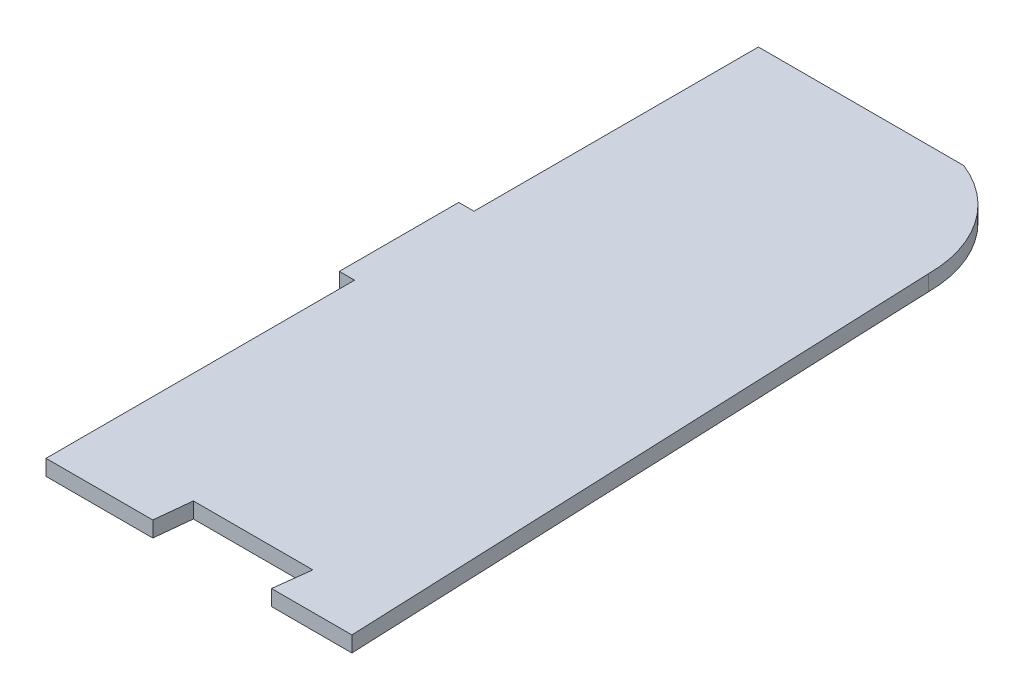
ISO-10303-21;
HEADER;
FILE_DESCRIPTION(('STEP AP214'),'2;1');
FILE_NAME('part.step','',(''),(''),'','','');
FILE_SCHEMA(('AUTOMOTIVE_DESIGN { 1 0 10303 214 1 1 1 1 }'));
ENDSEC;
DATA;
#1=APPLICATION_CONTEXT('core data for automotive mechanical design processes');
#2=APPLICATION_PROTOCOL_DEFINITION('international standard','automotive_design',2000,#1);
#3=PRODUCT_CONTEXT('',#1,'mechanical');
#4=PRODUCT('Part','Part','',(#3));
#5=PRODUCT_RELATED_PRODUCT_CATEGORY('part','',(#4));
#6=PRODUCT_DEFINITION_FORMATION('','',#4);
#7=PRODUCT_DEFINITION_CONTEXT('part definition',#1,'design');
#8=PRODUCT_DEFINITION('design','',#6,#7);
#9=PRODUCT_DEFINITION_SHAPE('','',#8);
#10=(LENGTH_UNIT() NAMED_UNIT(*) SI_UNIT(.MILLI.,.METRE.));
#11=(NAMED_UNIT(*) PLANE_ANGLE_UNIT() SI_UNIT($,.RADIAN.));
#12=(NAMED_UNIT(*) SI_UNIT($,.STERADIAN.) SOLID_ANGLE_UNIT());
#13=UNCERTAINTY_MEASURE_WITH_UNIT(LENGTH_MEASURE(1.E-05),#10,'distance_accuracy_value','');
#14=(GEOMETRIC_REPRESENTATION_CONTEXT(3) GLOBAL_UNCERTAINTY_ASSIGNED_CONTEXT((#13)) GLOBAL_UNIT_ASSIGNED_CONTEXT((#10,
#11,#12)) REPRESENTATION_CONTEXT('',''));
#15=CARTESIAN_POINT('',(0.,0.,0.));
#16=DIRECTION('',(0.,0.,1.));
#17=DIRECTION('',(1.,0.,0.));
#18=AXIS2_PLACEMENT_3D('',#15,#16,#17);
#19=CARTESIAN_POINT('',(358.121789204402,754.380000017288,879.470073525841));
#20=DIRECTION('',(0.,-1.,0.));
#21=DIRECTION('',(0.,0.,-1.));
#22=AXIS2_PLACEMENT_3D('',#19,#20,#21);
#23=PLANE('',#22);
#24=CARTESIAN_POINT('',(368.663785013315,754.380000017288,70.9700591000901));
#25=DIRECTION('',(0.,1.,0.));
#26=DIRECTION('',(0.,0.,1.));
#27=AXIS2_PLACEMENT_3D('',#24,#25,#26);
#28=CIRCLE('',#27,76.2);
#29=CARTESIAN_POINT('',(444.863785013315,754.380000017288,70.9700591000901));
#30=VERTEX_POINT('',#29);
#31=CARTESIAN_POINT('',(396.407085309598,754.380000017288,0.));
#32=VERTEX_POINT('',#31);
#33=EDGE_CURVE('E281',#30,#32,#28,.T.);
#34=ORIENTED_EDGE('',*,*,#33,.T.);
#35=DIRECTION('',(-1.,0.,0.));
#36=VECTOR('',#35,1.);
#37=CARTESIAN_POINT('',(358.121789204402,754.380000017288,0.));
#38=LINE('',#37,#36);
#39=CARTESIAN_POINT('',(265.355188860333,754.380000017288,0.));
#40=VERTEX_POINT('',#39);
#41=EDGE_CURVE('E218',#32,#40,#38,.T.);
#42=ORIENTED_EDGE('',*,*,#41,.T.);
#43=DIRECTION('',(0.,0.,-1.));
#44=VECTOR('',#43,1.);
#45=CARTESIAN_POINT('',(265.355188860333,754.380000017288,0.));
#46=LINE('',#45,#44);
#47=CARTESIAN_POINT('',(265.355188860333,754.380000017288,181.46005910007));
#48=VERTEX_POINT('',#47);
#49=EDGE_CURVE('E213',#48,#40,#46,.T.);
#50=ORIENTED_EDGE('',*,*,#49,.F.);
#51=DIRECTION('',(-1.,0.,0.));
#52=VECTOR('',#51,1.);
#53=CARTESIAN_POINT('',(0.,754.380000017288,181.46005910007));
#54=LINE('',#53,#52);
#55=CARTESIAN_POINT('',(255.630013474232,754.380000017288,181.46005910007));
#56=VERTEX_POINT('',#55);
#57=EDGE_CURVE('E196',#48,#56,#54,.T.);
#58=ORIENTED_EDGE('',*,*,#57,.T.);
#59=DIRECTION('',(0.,0.,1.));
#60=VECTOR('',#59,1.);
#61=CARTESIAN_POINT('',(255.630013474232,754.380000017288,0.));
#62=LINE('',#61,#60);
#63=CARTESIAN_POINT('',(255.630013474232,754.380000017288,257.66005910007));
#64=VERTEX_POINT('',#63);
#65=EDGE_CURVE('E211',#56,#64,#62,.T.);
#66=ORIENTED_EDGE('',*,*,#65,.T.);
#67=DIRECTION('',(-1.,0.,0.));
#68=VECTOR('',#67,1.);
#69=CARTESIAN_POINT('',(0.,754.380000017288,257.66005910007));
#70=LINE('',#69,#68);
#71=CARTESIAN_POINT('',(265.355188860333,754.380000017288,257.66005910007));
#72=VERTEX_POINT('',#71);
#73=EDGE_CURVE('E273',#72,#64,#70,.T.);
#74=ORIENTED_EDGE('',*,*,#73,.F.);
#75=DIRECTION('',(0.,0.,-1.));
#76=VECTOR('',#75,1.);
#77=CARTESIAN_POINT('',(265.355188860333,754.380000017288,0.));
#78=LINE('',#77,#76);
#79=CARTESIAN_POINT('',(265.355188860333,754.380000017288,454.510059100077));
#80=VERTEX_POINT('',#79);
#81=EDGE_CURVE('E214',#80,#72,#78,.T.);
#82=ORIENTED_EDGE('',*,*,#81,.F.);
#83=DIRECTION('',(-1.,0.,0.));
#84=VECTOR('',#83,1.);
#85=CARTESIAN_POINT('',(358.121789204402,754.380000017288,454.510059100077));
#86=LINE('',#85,#84);
#87=CARTESIAN_POINT('',(333.464234552155,754.380000017288,454.510059100077));
#88=VERTEX_POINT('',#87);
#89=EDGE_CURVE('E229',#88,#80,#86,.T.);
#90=ORIENTED_EDGE('',*,*,#89,.F.);
#91=DIRECTION('',(0.104367880030827,0.,-0.994538760239072));
#92=VECTOR('',#91,1.);
#93=CARTESIAN_POINT('',(333.464234552153,754.380000017288,454.51005910007));
#94=LINE('',#93,#92);
#95=CARTESIAN_POINT('',(335.927199538791,754.380000017288,431.040059100068));
#96=VERTEX_POINT('',#95);
#97=EDGE_CURVE('E291',#88,#96,#94,.T.);
#98=ORIENTED_EDGE('',*,*,#97,.T.);
#99=DIRECTION('',(1.,0.,0.));
#100=VECTOR('',#99,1.);
#101=CARTESIAN_POINT('',(335.927199538791,754.380000017288,431.040059100068));
#102=LINE('',#101,#100);
#103=CARTESIAN_POINT('',(412.127199538791,754.380000017288,431.040059100068));
#104=VERTEX_POINT('',#103);
#105=EDGE_CURVE('E288',#96,#104,#102,.T.);
#106=ORIENTED_EDGE('',*,*,#105,.T.);
#107=DIRECTION('',(-0.123062213374587,0.,0.992398957899164));
#108=VECTOR('',#107,1.);
#109=CARTESIAN_POINT('',(412.127199538791,754.380000017288,431.040059100068));
#110=LINE('',#109,#108);
#111=CARTESIAN_POINT('',(409.216807377542,754.380000017288,454.510059100077));
#112=VERTEX_POINT('',#111);
#113=EDGE_CURVE('E285',#104,#112,#110,.T.);
#114=ORIENTED_EDGE('',*,*,#113,.T.);
#115=CARTESIAN_POINT('',(460.501916297316,754.380000017288,454.510059100077));
#116=VERTEX_POINT('',#115);
#117=EDGE_CURVE('E235',#116,#112,#86,.T.);
#118=ORIENTED_EDGE('',*,*,#117,.F.);
#119=DIRECTION('',(-0.0407392936058545,0.,-0.999169810370838));
#120=VECTOR('',#119,1.);
#121=CARTESIAN_POINT('',(460.501916297315,754.380000017288,454.51005910007));
#122=LINE('',#121,#120);
#123=EDGE_CURVE('E112',#116,#30,#122,.T.);
#124=ORIENTED_EDGE('',*,*,#123,.T.);
#125=EDGE_LOOP('',(#34,#42,#50,#58,#66,#74,#82,#90,#98,#106,#114,#118,#124));
#126=FACE_BOUND('',#125,.T.);
#127=ADVANCED_FACE('F97',(#126),#23,.F.);
#128=CARTESIAN_POINT('',(562.803601280852,744.380000017288,879.470073525841));
#129=DIRECTION('',(0.,1.,0.));
#130=DIRECTION('',(0.,0.,1.));
#131=AXIS2_PLACEMENT_3D('',#128,#129,#130);
#132=PLANE('',#131);
#133=CARTESIAN_POINT('',(368.663785013315,744.380000017288,70.9700591000901));
#134=DIRECTION('',(0.,1.,0.));
#135=DIRECTION('',(0.,0.,1.));
#136=AXIS2_PLACEMENT_3D('',#133,#134,#135);
#137=CIRCLE('',#136,76.2);
#138=CARTESIAN_POINT('',(444.863785013315,744.380000017288,70.9700591000901));
#139=VERTEX_POINT('',#138);
#140=CARTESIAN_POINT('',(396.407085309598,744.380000017288,0.));
#141=VERTEX_POINT('',#140);
#142=EDGE_CURVE('E223',#139,#141,#137,.T.);
#143=ORIENTED_EDGE('',*,*,#142,.F.);
#144=DIRECTION('',(-0.0407392936058545,0.,-0.999169810370838));
#145=VECTOR('',#144,1.);
#146=CARTESIAN_POINT('',(477.969903467025,744.380000017288,882.929010021956));
#147=LINE('',#146,#145);
#148=CARTESIAN_POINT('',(460.501916297316,744.380000017288,454.510059100077));
#149=VERTEX_POINT('',#148);
#150=EDGE_CURVE('E257',#149,#139,#147,.T.);
#151=ORIENTED_EDGE('',*,*,#150,.F.);
#152=DIRECTION('',(1.,0.,0.));
#153=VECTOR('',#152,1.);
#154=CARTESIAN_POINT('',(562.803601280852,744.380000017288,454.510059100077));
#155=LINE('',#154,#153);
#156=CARTESIAN_POINT('',(409.216807377541,744.380000017288,454.510059100077));
#157=VERTEX_POINT('',#156);
#158=EDGE_CURVE('E231',#157,#149,#155,.T.);
#159=ORIENTED_EDGE('',*,*,#158,.F.);
#160=DIRECTION('',(-0.123062213374587,0.,0.992398957899165));
#161=VECTOR('',#160,1.);
#162=CARTESIAN_POINT('',(359.643761223632,744.380000017288,854.277282474151));
#163=LINE('',#162,#161);
#164=CARTESIAN_POINT('',(412.127199538791,744.380000017288,431.040059100068));
#165=VERTEX_POINT('',#164);
#166=EDGE_CURVE('E120',#165,#157,#163,.T.);
#167=ORIENTED_EDGE('',*,*,#166,.F.);
#168=DIRECTION('',(1.,0.,0.));
#169=VECTOR('',#168,1.);
#170=CARTESIAN_POINT('',(562.803601280852,744.380000017288,431.040059100068));
#171=LINE('',#170,#169);
#172=CARTESIAN_POINT('',(335.927199538791,744.380000017288,431.040059100068));
#173=VERTEX_POINT('',#172);
#174=EDGE_CURVE('E12',#173,#165,#171,.T.);
#175=ORIENTED_EDGE('',*,*,#174,.F.);
#176=DIRECTION('',(0.104367880030827,0.,-0.994538760239072));
#177=VECTOR('',#176,1.);
#178=CARTESIAN_POINT('',(291.852391072639,744.380000017288,851.036185846672));
#179=LINE('',#178,#177);
#180=CARTESIAN_POINT('',(333.464234552155,744.380000017288,454.510059100077));
#181=VERTEX_POINT('',#180);
#182=EDGE_CURVE('E258',#181,#173,#179,.T.);
#183=ORIENTED_EDGE('',*,*,#182,.F.);
#184=CARTESIAN_POINT('',(265.355188860333,744.380000017288,454.510059100077));
#185=VERTEX_POINT('',#184);
#186=EDGE_CURVE('E234',#185,#181,#155,.T.);
#187=ORIENTED_EDGE('',*,*,#186,.F.);
#188=DIRECTION('',(0.,0.,-1.));
#189=VECTOR('',#188,1.);
#190=CARTESIAN_POINT('',(265.355188860333,744.380000017288,879.470073525841));
#191=LINE('',#190,#189);
#192=CARTESIAN_POINT('',(265.355188860333,744.380000017288,257.66005910007));
#193=VERTEX_POINT('',#192);
#194=EDGE_CURVE('E263',#185,#193,#191,.T.);
#195=ORIENTED_EDGE('',*,*,#194,.T.);
#196=DIRECTION('',(-1.,0.,0.));
#197=VECTOR('',#196,1.);
#198=CARTESIAN_POINT('',(562.803601280852,744.380000017288,257.66005910007));
#199=LINE('',#198,#197);
#200=CARTESIAN_POINT('',(255.630013474232,744.380000017288,257.66005910007));
#201=VERTEX_POINT('',#200);
#202=EDGE_CURVE('E267',#193,#201,#199,.T.);
#203=ORIENTED_EDGE('',*,*,#202,.T.);
#204=DIRECTION('',(0.,0.,1.));
#205=VECTOR('',#204,1.);
#206=CARTESIAN_POINT('',(255.630013474232,744.380000017288,0.));
#207=LINE('',#206,#205);
#208=CARTESIAN_POINT('',(255.630013474232,744.380000017288,181.46005910007));
#209=VERTEX_POINT('',#208);
#210=EDGE_CURVE('E219',#209,#201,#207,.T.);
#211=ORIENTED_EDGE('',*,*,#210,.F.);
#212=DIRECTION('',(-1.,0.,0.));
#213=VECTOR('',#212,1.);
#214=CARTESIAN_POINT('',(562.803601280852,744.380000017288,181.46005910007));
#215=LINE('',#214,#213);
#216=CARTESIAN_POINT('',(265.355188860333,744.380000017288,181.46005910007));
#217=VERTEX_POINT('',#216);
#218=EDGE_CURVE('E199',#217,#209,#215,.T.);
#219=ORIENTED_EDGE('',*,*,#218,.F.);
#220=DIRECTION('',(0.,0.,-1.));
#221=VECTOR('',#220,1.);
#222=CARTESIAN_POINT('',(265.355188860333,744.380000017288,879.470073525841));
#223=LINE('',#222,#221);
#224=CARTESIAN_POINT('',(265.355188860333,744.380000017288,0.));
#225=VERTEX_POINT('',#224);
#226=EDGE_CURVE('E255',#217,#225,#223,.T.);
#227=ORIENTED_EDGE('',*,*,#226,.T.);
#228=DIRECTION('',(1.,0.,0.));
#229=VECTOR('',#228,1.);
#230=CARTESIAN_POINT('',(562.803601280852,744.380000017288,0.));
#231=LINE('',#230,#229);
#232=EDGE_CURVE('E221',#225,#141,#231,.T.);
#233=ORIENTED_EDGE('',*,*,#232,.T.);
#234=EDGE_LOOP('',(#143,#151,#159,#167,#175,#183,#187,#195,#203,#211,#219,#227,#233));
#235=FACE_BOUND('',#234,.T.);
#236=ADVANCED_FACE('F253',(#235),#132,.F.);
#237=CARTESIAN_POINT('',(0.,0.,0.));
#238=DIRECTION('',(0.,0.,-1.));
#239=DIRECTION('',(-1.,0.,0.));
#240=AXIS2_PLACEMENT_3D('',#237,#238,#239);
#241=PLANE('',#240);
#242=ORIENTED_EDGE('',*,*,#41,.F.);
#243=DIRECTION('',(0.,1.,0.));
#244=VECTOR('',#243,1.);
#245=CARTESIAN_POINT('',(396.407085309598,691.380000017288,0.));
#246=LINE('',#245,#244);
#247=EDGE_CURVE('E105',#32,#141,#246,.F.);
#248=ORIENTED_EDGE('',*,*,#247,.T.);
#249=ORIENTED_EDGE('',*,*,#232,.F.);
#250=DIRECTION('',(0.,1.,0.));
#251=VECTOR('',#250,1.);
#252=CARTESIAN_POINT('',(265.355188860333,691.380000017288,0.));
#253=LINE('',#252,#251);
#254=EDGE_CURVE('E283',#225,#40,#253,.T.);
#255=ORIENTED_EDGE('',*,*,#254,.T.);
#256=EDGE_LOOP('',(#242,#248,#249,#255));
#257=FACE_BOUND('',#256,.T.);
#258=ADVANCED_FACE('F246',(#257),#241,.T.);
#259=CARTESIAN_POINT('',(-14.2045246142966,224.651580472006,454.510059100077));
#260=DIRECTION('',(0.,0.,1.));
#261=DIRECTION('',(1.,0.,0.));
#262=AXIS2_PLACEMENT_3D('',#259,#260,#261);
#263=PLANE('',#262);
#264=ORIENTED_EDGE('',*,*,#158,.T.);
#265=DIRECTION('',(0.,1.,0.));
#266=VECTOR('',#265,1.);
#267=CARTESIAN_POINT('',(460.501916297316,224.651580472006,454.510059100077));
#268=LINE('',#267,#266);
#269=EDGE_CURVE('E241',#149,#116,#268,.T.);
#270=ORIENTED_EDGE('',*,*,#269,.T.);
#271=ORIENTED_EDGE('',*,*,#117,.T.);
#272=DIRECTION('',(0.,-1.,0.));
#273=VECTOR('',#272,1.);
#274=CARTESIAN_POINT('',(409.216807377541,691.380000017288,454.510059100077));
#275=LINE('',#274,#273);
#276=EDGE_CURVE('E278',#112,#157,#275,.T.);
#277=ORIENTED_EDGE('',*,*,#276,.T.);
#278=EDGE_LOOP('',(#264,#270,#271,#277));
#279=FACE_BOUND('',#278,.T.);
#280=ADVANCED_FACE('F99',(#279),#263,.T.);
#281=ORIENTED_EDGE('',*,*,#186,.T.);
#282=DIRECTION('',(0.,1.,0.));
#283=VECTOR('',#282,1.);
#284=CARTESIAN_POINT('',(333.464234552152,224.651580472006,454.510059100077));
#285=LINE('',#284,#283);
#286=EDGE_CURVE('E204',#181,#88,#285,.T.);
#287=ORIENTED_EDGE('',*,*,#286,.T.);
#288=ORIENTED_EDGE('',*,*,#89,.T.);
#289=DIRECTION('',(0.,1.,0.));
#290=VECTOR('',#289,1.);
#291=CARTESIAN_POINT('',(265.355188860333,691.380000017288,454.510059100077));
#292=LINE('',#291,#290);
#293=EDGE_CURVE('E270',#185,#80,#292,.T.);
#294=ORIENTED_EDGE('',*,*,#293,.F.);
#295=EDGE_LOOP('',(#281,#287,#288,#294));
#296=FACE_BOUND('',#295,.T.);
#297=ADVANCED_FACE('F324',(#296),#263,.T.);
#298=CARTESIAN_POINT('',(255.630013474232,754.380000017288,0.));
#299=DIRECTION('',(1.,0.,0.));
#300=DIRECTION('',(0.,0.,-1.));
#301=AXIS2_PLACEMENT_3D('',#298,#299,#300);
#302=PLANE('',#301);
#303=DIRECTION('',(0.,1.,0.));
#304=VECTOR('',#303,1.);
#305=CARTESIAN_POINT('',(255.630013474232,754.380000017288,181.46005910007));
#306=LINE('',#305,#304);
#307=EDGE_CURVE('E192',#209,#56,#306,.T.);
#308=ORIENTED_EDGE('',*,*,#307,.F.);
#309=ORIENTED_EDGE('',*,*,#210,.T.);
#310=DIRECTION('',(0.,1.,0.));
#311=VECTOR('',#310,1.);
#312=CARTESIAN_POINT('',(255.630013474232,754.380000017288,257.66005910007));
#313=LINE('',#312,#311);
#314=EDGE_CURVE('E205',#201,#64,#313,.T.);
#315=ORIENTED_EDGE('',*,*,#314,.T.);
#316=ORIENTED_EDGE('',*,*,#65,.F.);
#317=EDGE_LOOP('',(#308,#309,#315,#316));
#318=FACE_BOUND('',#317,.T.);
#319=ADVANCED_FACE('F217',(#318),#302,.F.);
#320=CARTESIAN_POINT('',(265.355188860333,691.380000017288,0.));
#321=DIRECTION('',(1.,0.,0.));
#322=DIRECTION('',(0.,0.,-1.));
#323=AXIS2_PLACEMENT_3D('',#320,#321,#322);
#324=PLANE('',#323);
#325=ORIENTED_EDGE('',*,*,#293,.T.);
#326=ORIENTED_EDGE('',*,*,#81,.T.);
#327=DIRECTION('',(0.,1.,0.));
#328=VECTOR('',#327,1.);
#329=CARTESIAN_POINT('',(265.355188860333,691.380000017288,257.66005910007));
#330=LINE('',#329,#328);
#331=EDGE_CURVE('E271',#193,#72,#330,.T.);
#332=ORIENTED_EDGE('',*,*,#331,.F.);
#333=ORIENTED_EDGE('',*,*,#194,.F.);
#334=EDGE_LOOP('',(#325,#326,#332,#333));
#335=FACE_BOUND('',#334,.T.);
#336=ADVANCED_FACE('F327',(#335),#324,.F.);
#337=CARTESIAN_POINT('',(0.,691.380000017288,257.66005910007));
#338=DIRECTION('',(0.,0.,-1.));
#339=DIRECTION('',(-1.,0.,0.));
#340=AXIS2_PLACEMENT_3D('',#337,#338,#339);
#341=PLANE('',#340);
#342=ORIENTED_EDGE('',*,*,#331,.T.);
#343=ORIENTED_EDGE('',*,*,#73,.T.);
#344=ORIENTED_EDGE('',*,*,#314,.F.);
#345=ORIENTED_EDGE('',*,*,#202,.F.);
#346=EDGE_LOOP('',(#342,#343,#344,#345));
#347=FACE_BOUND('',#346,.T.);
#348=ADVANCED_FACE('F330',(#347),#341,.F.);
#349=CARTESIAN_POINT('',(265.355188860333,691.380000017288,0.));
#350=DIRECTION('',(1.,0.,0.));
#351=DIRECTION('',(0.,0.,-1.));
#352=AXIS2_PLACEMENT_3D('',#349,#350,#351);
#353=PLANE('',#352);
#354=DIRECTION('',(0.,1.,0.));
#355=VECTOR('',#354,1.);
#356=CARTESIAN_POINT('',(265.355188860333,691.380000017288,181.46005910007));
#357=LINE('',#356,#355);
#358=EDGE_CURVE('E300',#217,#48,#357,.T.);
#359=ORIENTED_EDGE('',*,*,#358,.T.);
#360=ORIENTED_EDGE('',*,*,#49,.T.);
#361=ORIENTED_EDGE('',*,*,#254,.F.);
#362=ORIENTED_EDGE('',*,*,#226,.F.);
#363=EDGE_LOOP('',(#359,#360,#361,#362));
#364=FACE_BOUND('',#363,.T.);
#365=ADVANCED_FACE('F302',(#364),#353,.F.);
#366=CARTESIAN_POINT('',(0.,691.380000017288,181.46005910007));
#367=DIRECTION('',(0.,0.,-1.));
#368=DIRECTION('',(-1.,0.,0.));
#369=AXIS2_PLACEMENT_3D('',#366,#367,#368);
#370=PLANE('',#369);
#371=ORIENTED_EDGE('',*,*,#218,.T.);
#372=ORIENTED_EDGE('',*,*,#307,.T.);
#373=ORIENTED_EDGE('',*,*,#57,.F.);
#374=ORIENTED_EDGE('',*,*,#358,.F.);
#375=EDGE_LOOP('',(#371,#372,#373,#374));
#376=FACE_BOUND('',#375,.T.);
#377=ADVANCED_FACE('F194',(#376),#370,.T.);
#378=CARTESIAN_POINT('',(412.127199538791,691.380000017288,431.040059100068));
#379=DIRECTION('',(-0.992398957899165,0.,-0.123062213374587));
#380=DIRECTION('',(-0.123062213374587,0.,0.992398957899165));
#381=AXIS2_PLACEMENT_3D('',#378,#379,#380);
#382=PLANE('',#381);
#383=ORIENTED_EDGE('',*,*,#166,.T.);
#384=ORIENTED_EDGE('',*,*,#276,.F.);
#385=ORIENTED_EDGE('',*,*,#113,.F.);
#386=DIRECTION('',(0.,1.,0.));
#387=VECTOR('',#386,1.);
#388=CARTESIAN_POINT('',(412.127199538791,691.380000017288,431.040059100068));
#389=LINE('',#388,#387);
#390=EDGE_CURVE('E296',#165,#104,#389,.T.);
#391=ORIENTED_EDGE('',*,*,#390,.F.);
#392=EDGE_LOOP('',(#383,#384,#385,#391));
#393=FACE_BOUND('',#392,.T.);
#394=ADVANCED_FACE('F311',(#393),#382,.T.);
#395=CARTESIAN_POINT('',(333.464234552153,691.380000017288,454.51005910007));
#396=DIRECTION('',(0.994538760239072,0.,0.104367880030827));
#397=DIRECTION('',(0.104367880030827,0.,-0.994538760239072));
#398=AXIS2_PLACEMENT_3D('',#395,#396,#397);
#399=PLANE('',#398);
#400=ORIENTED_EDGE('',*,*,#182,.T.);
#401=DIRECTION('',(0.,1.,0.));
#402=VECTOR('',#401,1.);
#403=CARTESIAN_POINT('',(335.927199538791,691.380000017288,431.040059100068));
#404=LINE('',#403,#402);
#405=EDGE_CURVE('E280',#173,#96,#404,.T.);
#406=ORIENTED_EDGE('',*,*,#405,.T.);
#407=ORIENTED_EDGE('',*,*,#97,.F.);
#408=ORIENTED_EDGE('',*,*,#286,.F.);
#409=EDGE_LOOP('',(#400,#406,#407,#408));
#410=FACE_BOUND('',#409,.T.);
#411=ADVANCED_FACE('F402',(#410),#399,.T.);
#412=CARTESIAN_POINT('',(335.927199538791,691.380000017288,431.040059100068));
#413=DIRECTION('',(0.,0.,1.));
#414=DIRECTION('',(1.,0.,0.));
#415=AXIS2_PLACEMENT_3D('',#412,#413,#414);
#416=PLANE('',#415);
#417=ORIENTED_EDGE('',*,*,#174,.T.);
#418=ORIENTED_EDGE('',*,*,#390,.T.);
#419=ORIENTED_EDGE('',*,*,#105,.F.);
#420=ORIENTED_EDGE('',*,*,#405,.F.);
#421=EDGE_LOOP('',(#417,#418,#419,#420));
#422=FACE_BOUND('',#421,.T.);
#423=ADVANCED_FACE('F316',(#422),#416,.T.);
#424=CARTESIAN_POINT('',(368.663785013315,691.380000017288,70.9700591000901));
#425=DIRECTION('',(0.,1.,0.));
#426=DIRECTION('',(0.,0.,1.));
#427=AXIS2_PLACEMENT_3D('',#424,#425,#426);
#428=CYLINDRICAL_SURFACE('',#427,76.2);
#429=ORIENTED_EDGE('',*,*,#142,.T.);
#430=ORIENTED_EDGE('',*,*,#247,.F.);
#431=ORIENTED_EDGE('',*,*,#33,.F.);
#432=DIRECTION('',(0.,1.,0.));
#433=VECTOR('',#432,1.);
#434=CARTESIAN_POINT('',(444.863785013315,691.380000017288,70.9700591000901));
#435=LINE('',#434,#433);
#436=EDGE_CURVE('E294',#139,#30,#435,.T.);
#437=ORIENTED_EDGE('',*,*,#436,.F.);
#438=EDGE_LOOP('',(#429,#430,#431,#437));
#439=FACE_BOUND('',#438,.T.);
#440=ADVANCED_FACE('F305',(#439),#428,.T.);
#441=CARTESIAN_POINT('',(460.501916297315,691.380000017288,454.51005910007));
#442=DIRECTION('',(0.999169810370838,0.,-0.0407392936058545));
#443=DIRECTION('',(-0.0407392936058545,0.,-0.999169810370838));
#444=AXIS2_PLACEMENT_3D('',#441,#442,#443);
#445=PLANE('',#444);
#446=ORIENTED_EDGE('',*,*,#150,.T.);
#447=ORIENTED_EDGE('',*,*,#436,.T.);
#448=ORIENTED_EDGE('',*,*,#123,.F.);
#449=ORIENTED_EDGE('',*,*,#269,.F.);
#450=EDGE_LOOP('',(#446,#447,#448,#449));
#451=FACE_BOUND('',#450,.T.);
#452=ADVANCED_FACE('F306',(#451),#445,.T.);
#453=CLOSED_SHELL('',(#127,#236,#258,#280,#297,#319,#336,#348,#365,#377,#394,#411,#423,#440,#452));
#454=MANIFOLD_SOLID_BREP('B2',#453);
#455=ADVANCED_BREP_SHAPE_REPRESENTATION('',(#18,#454),#14);
#456=SHAPE_DEFINITION_REPRESENTATION(#9,#455);
ENDSEC;
END-ISO-10303-21;
